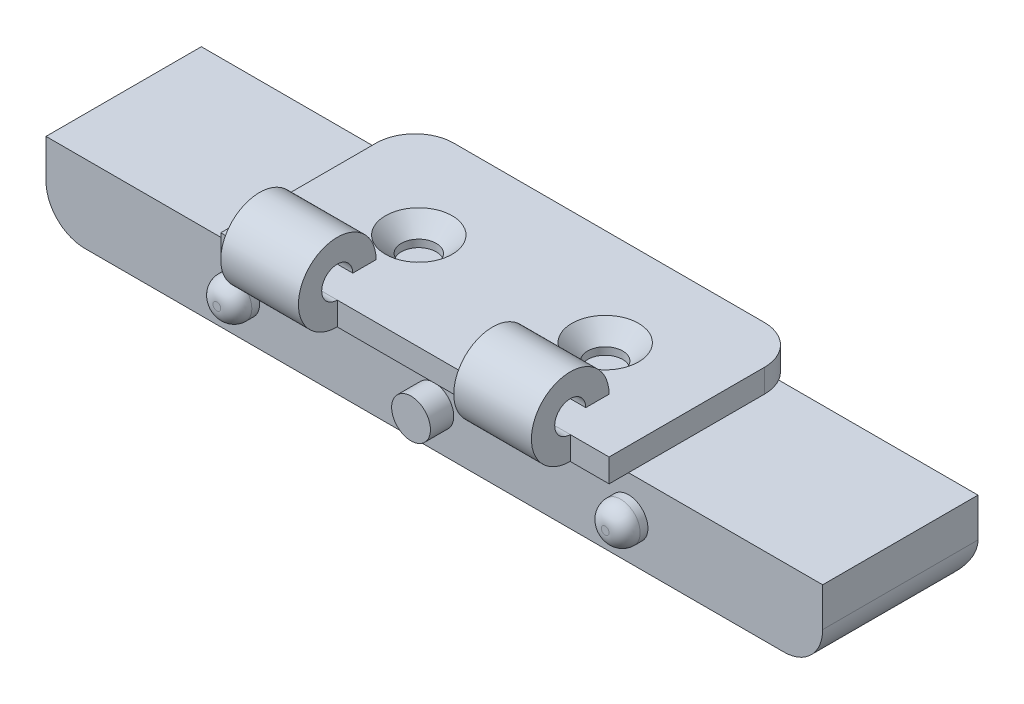
ISO-10303-21;
HEADER;
FILE_DESCRIPTION(('STEP AP214'),'2;1');
FILE_NAME('part.step','',(''),(''),'','','');
FILE_SCHEMA(('AUTOMOTIVE_DESIGN { 1 0 10303 214 1 1 1 1 }'));
ENDSEC;
DATA;
#1=APPLICATION_CONTEXT('core data for automotive mechanical design processes');
#2=APPLICATION_PROTOCOL_DEFINITION('international standard','automotive_design',2000,#1);
#3=PRODUCT_CONTEXT('',#1,'mechanical');
#4=PRODUCT('Part','Part','',(#3));
#5=PRODUCT_RELATED_PRODUCT_CATEGORY('part','',(#4));
#6=PRODUCT_DEFINITION_FORMATION('','',#4);
#7=PRODUCT_DEFINITION_CONTEXT('part definition',#1,'design');
#8=PRODUCT_DEFINITION('design','',#6,#7);
#9=PRODUCT_DEFINITION_SHAPE('','',#8);
#10=(LENGTH_UNIT() NAMED_UNIT(*) SI_UNIT(.MILLI.,.METRE.));
#11=(NAMED_UNIT(*) PLANE_ANGLE_UNIT() SI_UNIT($,.RADIAN.));
#12=(NAMED_UNIT(*) SI_UNIT($,.STERADIAN.) SOLID_ANGLE_UNIT());
#13=UNCERTAINTY_MEASURE_WITH_UNIT(LENGTH_MEASURE(1.E-05),#10,'distance_accuracy_value','');
#14=(GEOMETRIC_REPRESENTATION_CONTEXT(3) GLOBAL_UNCERTAINTY_ASSIGNED_CONTEXT((#13)) GLOBAL_UNIT_ASSIGNED_CONTEXT((#10,
#11,#12)) REPRESENTATION_CONTEXT('',''));
#15=CARTESIAN_POINT('',(0.,0.,0.));
#16=DIRECTION('',(0.,0.,1.));
#17=DIRECTION('',(1.,0.,0.));
#18=AXIS2_PLACEMENT_3D('',#15,#16,#17);
#19=CARTESIAN_POINT('',(-20.,-3.,-7.5));
#20=DIRECTION('',(0.,-1.,0.));
#21=DIRECTION('',(0.,0.,-1.));
#22=AXIS2_PLACEMENT_3D('',#19,#20,#21);
#23=PLANE('',#22);
#24=DIRECTION('',(1.,0.,0.));
#25=VECTOR('',#24,1.);
#26=CARTESIAN_POINT('',(-50.,-3.,10.));
#27=LINE('',#26,#25);
#28=CARTESIAN_POINT('',(-25.,-3.,10.));
#29=VERTEX_POINT('',#28);
#30=CARTESIAN_POINT('',(25.,-3.,10.));
#31=VERTEX_POINT('',#30);
#32=EDGE_CURVE('E228',#29,#31,#27,.T.);
#33=ORIENTED_EDGE('',*,*,#32,.T.);
#34=DIRECTION('',(0.,0.,-1.));
#35=VECTOR('',#34,1.);
#36=CARTESIAN_POINT('',(25.,-3.,12.5));
#37=LINE('',#36,#35);
#38=CARTESIAN_POINT('',(25.,-3.,12.5));
#39=VERTEX_POINT('',#38);
#40=EDGE_CURVE('E330',#39,#31,#37,.T.);
#41=ORIENTED_EDGE('',*,*,#40,.F.);
#42=DIRECTION('',(1.,0.,0.));
#43=VECTOR('',#42,1.);
#44=CARTESIAN_POINT('',(-25.,-3.,12.5));
#45=LINE('',#44,#43);
#46=CARTESIAN_POINT('',(20.,-3.,12.5));
#47=VERTEX_POINT('',#46);
#48=EDGE_CURVE('E325',#47,#39,#45,.T.);
#49=ORIENTED_EDGE('',*,*,#48,.F.);
#50=DIRECTION('',(1.,0.,0.));
#51=VECTOR('',#50,1.);
#52=CARTESIAN_POINT('',(20.,-3.,12.5));
#53=LINE('',#52,#51);
#54=CARTESIAN_POINT('',(10.,-3.,12.5));
#55=VERTEX_POINT('',#54);
#56=EDGE_CURVE('E289',#47,#55,#53,.F.);
#57=ORIENTED_EDGE('',*,*,#56,.T.);
#58=CARTESIAN_POINT('',(-10.,-3.,12.5));
#59=VERTEX_POINT('',#58);
#60=EDGE_CURVE('E331',#59,#55,#45,.T.);
#61=ORIENTED_EDGE('',*,*,#60,.F.);
#62=DIRECTION('',(1.,0.,0.));
#63=VECTOR('',#62,1.);
#64=CARTESIAN_POINT('',(-10.,-3.,12.5));
#65=LINE('',#64,#63);
#66=CARTESIAN_POINT('',(-20.,-3.,12.5));
#67=VERTEX_POINT('',#66);
#68=EDGE_CURVE('E258',#59,#67,#65,.F.);
#69=ORIENTED_EDGE('',*,*,#68,.T.);
#70=CARTESIAN_POINT('',(-25.,-3.,12.5));
#71=VERTEX_POINT('',#70);
#72=EDGE_CURVE('E327',#71,#67,#45,.T.);
#73=ORIENTED_EDGE('',*,*,#72,.F.);
#74=DIRECTION('',(0.,0.,1.));
#75=VECTOR('',#74,1.);
#76=CARTESIAN_POINT('',(-25.,-3.,12.5));
#77=LINE('',#76,#75);
#78=EDGE_CURVE('E326',#29,#71,#77,.T.);
#79=ORIENTED_EDGE('',*,*,#78,.F.);
#80=EDGE_LOOP('',(#33,#41,#49,#57,#61,#69,#73,#79));
#81=FACE_BOUND('',#80,.T.);
#82=ADVANCED_FACE('F39',(#81),#23,.T.);
#83=CARTESIAN_POINT('',(-20.,0.,-7.5));
#84=DIRECTION('',(0.,-1.,0.));
#85=DIRECTION('',(0.,0.,-1.));
#86=AXIS2_PLACEMENT_3D('',#83,#84,#85);
#87=PLANE('',#86);
#88=CARTESIAN_POINT('',(-12.,0.,0.));
#89=DIRECTION('',(0.,1.,0.));
#90=DIRECTION('',(0.,0.,1.));
#91=AXIS2_PLACEMENT_3D('',#88,#89,#90);
#92=CIRCLE('',#91,4.3);
#93=CARTESIAN_POINT('',(-12.,0.,4.3));
#94=VERTEX_POINT('',#93);
#95=EDGE_CURVE('E239',#94,#94,#92,.T.);
#96=ORIENTED_EDGE('',*,*,#95,.F.);
#97=EDGE_LOOP('',(#96));
#98=FACE_BOUND('',#97,.T.);
#99=DIRECTION('',(0.,0.,1.));
#100=VECTOR('',#99,1.);
#101=CARTESIAN_POINT('',(-25.,0.,12.5));
#102=LINE('',#101,#100);
#103=CARTESIAN_POINT('',(-25.,0.,-7.49999999999997));
#104=VERTEX_POINT('',#103);
#105=CARTESIAN_POINT('',(-25.,0.,12.5));
#106=VERTEX_POINT('',#105);
#107=EDGE_CURVE('E319',#104,#106,#102,.T.);
#108=ORIENTED_EDGE('',*,*,#107,.T.);
#109=DIRECTION('',(1.,0.,0.));
#110=VECTOR('',#109,1.);
#111=CARTESIAN_POINT('',(-25.,0.,12.5));
#112=LINE('',#111,#110);
#113=CARTESIAN_POINT('',(-20.,0.,12.5));
#114=VERTEX_POINT('',#113);
#115=EDGE_CURVE('E347',#106,#114,#112,.T.);
#116=ORIENTED_EDGE('',*,*,#115,.T.);
#117=DIRECTION('',(1.,0.,0.));
#118=VECTOR('',#117,1.);
#119=CARTESIAN_POINT('',(-10.,0.,12.5));
#120=LINE('',#119,#118);
#121=CARTESIAN_POINT('',(-10.,0.,12.5));
#122=VERTEX_POINT('',#121);
#123=EDGE_CURVE('E273',#122,#114,#120,.F.);
#124=ORIENTED_EDGE('',*,*,#123,.F.);
#125=CARTESIAN_POINT('',(10.,0.,12.5));
#126=VERTEX_POINT('',#125);
#127=EDGE_CURVE('E351',#122,#126,#112,.T.);
#128=ORIENTED_EDGE('',*,*,#127,.T.);
#129=DIRECTION('',(1.,0.,0.));
#130=VECTOR('',#129,1.);
#131=CARTESIAN_POINT('',(20.,0.,12.5));
#132=LINE('',#131,#130);
#133=CARTESIAN_POINT('',(20.,0.,12.5));
#134=VERTEX_POINT('',#133);
#135=EDGE_CURVE('E304',#134,#126,#132,.F.);
#136=ORIENTED_EDGE('',*,*,#135,.F.);
#137=CARTESIAN_POINT('',(25.,0.,12.5));
#138=VERTEX_POINT('',#137);
#139=EDGE_CURVE('E346',#134,#138,#112,.T.);
#140=ORIENTED_EDGE('',*,*,#139,.T.);
#141=DIRECTION('',(0.,0.,-1.));
#142=VECTOR('',#141,1.);
#143=CARTESIAN_POINT('',(25.,0.,12.5));
#144=LINE('',#143,#142);
#145=CARTESIAN_POINT('',(25.,0.,-7.49999999999997));
#146=VERTEX_POINT('',#145);
#147=EDGE_CURVE('E350',#138,#146,#144,.T.);
#148=ORIENTED_EDGE('',*,*,#147,.T.);
#149=CARTESIAN_POINT('',(20.,0.,-7.5));
#150=DIRECTION('',(0.,1.,0.));
#151=DIRECTION('',(0.,0.,-1.));
#152=AXIS2_PLACEMENT_3D('',#149,#150,#151);
#153=CIRCLE('',#152,5.);
#154=CARTESIAN_POINT('',(20.,0.,-12.5));
#155=VERTEX_POINT('',#154);
#156=EDGE_CURVE('E354',#146,#155,#153,.T.);
#157=ORIENTED_EDGE('',*,*,#156,.T.);
#158=DIRECTION('',(-1.,0.,0.));
#159=VECTOR('',#158,1.);
#160=CARTESIAN_POINT('',(-20.,0.,-12.5));
#161=LINE('',#160,#159);
#162=CARTESIAN_POINT('',(-20.,0.,-12.5));
#163=VERTEX_POINT('',#162);
#164=EDGE_CURVE('E357',#155,#163,#161,.T.);
#165=ORIENTED_EDGE('',*,*,#164,.T.);
#166=CARTESIAN_POINT('',(-20.,0.,-7.5));
#167=DIRECTION('',(0.,1.,0.));
#168=DIRECTION('',(0.,0.,-1.));
#169=AXIS2_PLACEMENT_3D('',#166,#167,#168);
#170=CIRCLE('',#169,5.);
#171=EDGE_CURVE('E360',#163,#104,#170,.T.);
#172=ORIENTED_EDGE('',*,*,#171,.T.);
#173=EDGE_LOOP('',(#108,#116,#124,#128,#136,#140,#148,#157,#165,#172));
#174=FACE_BOUND('',#173,.T.);
#175=CARTESIAN_POINT('',(12.,0.,0.));
#176=DIRECTION('',(0.,1.,0.));
#177=DIRECTION('',(0.,0.,1.));
#178=AXIS2_PLACEMENT_3D('',#175,#176,#177);
#179=CIRCLE('',#178,4.3);
#180=CARTESIAN_POINT('',(12.,0.,4.3));
#181=VERTEX_POINT('',#180);
#182=EDGE_CURVE('E248',#181,#181,#179,.T.);
#183=ORIENTED_EDGE('',*,*,#182,.F.);
#184=EDGE_LOOP('',(#183));
#185=FACE_BOUND('',#184,.T.);
#186=ADVANCED_FACE('F413',(#98,#174,#185),#87,.F.);
#187=CARTESIAN_POINT('',(-25.,-3.,12.5));
#188=DIRECTION('',(0.,0.,1.));
#189=DIRECTION('',(1.,0.,0.));
#190=AXIS2_PLACEMENT_3D('',#187,#188,#189);
#191=PLANE('',#190);
#192=ORIENTED_EDGE('',*,*,#127,.F.);
#193=DIRECTION('',(0.,-1.,0.));
#194=VECTOR('',#193,1.);
#195=CARTESIAN_POINT('',(-10.,0.,12.5));
#196=LINE('',#195,#194);
#197=EDGE_CURVE('E265',#122,#59,#196,.T.);
#198=ORIENTED_EDGE('',*,*,#197,.T.);
#199=ORIENTED_EDGE('',*,*,#60,.T.);
#200=DIRECTION('',(0.,-1.,0.));
#201=VECTOR('',#200,1.);
#202=CARTESIAN_POINT('',(10.,0.,12.5));
#203=LINE('',#202,#201);
#204=EDGE_CURVE('E312',#126,#55,#203,.T.);
#205=ORIENTED_EDGE('',*,*,#204,.F.);
#206=EDGE_LOOP('',(#192,#198,#199,#205));
#207=FACE_BOUND('',#206,.T.);
#208=ADVANCED_FACE('F422',(#207),#191,.T.);
#209=ORIENTED_EDGE('',*,*,#139,.F.);
#210=DIRECTION('',(0.,-1.,0.));
#211=VECTOR('',#210,1.);
#212=CARTESIAN_POINT('',(20.,0.,12.5));
#213=LINE('',#212,#211);
#214=EDGE_CURVE('E296',#134,#47,#213,.T.);
#215=ORIENTED_EDGE('',*,*,#214,.T.);
#216=ORIENTED_EDGE('',*,*,#48,.T.);
#217=DIRECTION('',(0.,1.,0.));
#218=VECTOR('',#217,1.);
#219=CARTESIAN_POINT('',(25.,-3.,12.5));
#220=LINE('',#219,#218);
#221=EDGE_CURVE('E372',#39,#138,#220,.T.);
#222=ORIENTED_EDGE('',*,*,#221,.T.);
#223=EDGE_LOOP('',(#209,#215,#216,#222));
#224=FACE_BOUND('',#223,.T.);
#225=ADVANCED_FACE('F442',(#224),#191,.T.);
#226=CARTESIAN_POINT('',(-25.,-3.,12.5));
#227=DIRECTION('',(-1.,0.,0.));
#228=DIRECTION('',(0.,0.,1.));
#229=AXIS2_PLACEMENT_3D('',#226,#227,#228);
#230=PLANE('',#229);
#231=ORIENTED_EDGE('',*,*,#107,.F.);
#232=DIRECTION('',(0.,1.,0.));
#233=VECTOR('',#232,1.);
#234=CARTESIAN_POINT('',(-25.,-3.,-7.49999999999997));
#235=LINE('',#234,#233);
#236=CARTESIAN_POINT('',(-25.,-3.,-7.49999999999997));
#237=VERTEX_POINT('',#236);
#238=EDGE_CURVE('E363',#237,#104,#235,.T.);
#239=ORIENTED_EDGE('',*,*,#238,.F.);
#240=EDGE_CURVE('E322',#237,#29,#77,.T.);
#241=ORIENTED_EDGE('',*,*,#240,.T.);
#242=ORIENTED_EDGE('',*,*,#78,.T.);
#243=DIRECTION('',(0.,1.,0.));
#244=VECTOR('',#243,1.);
#245=CARTESIAN_POINT('',(-25.,-3.,12.5));
#246=LINE('',#245,#244);
#247=EDGE_CURVE('E343',#71,#106,#246,.T.);
#248=ORIENTED_EDGE('',*,*,#247,.T.);
#249=EDGE_LOOP('',(#231,#239,#241,#242,#248));
#250=FACE_BOUND('',#249,.T.);
#251=ADVANCED_FACE('F834',(#250),#230,.T.);
#252=CARTESIAN_POINT('',(-20.,-3.,-7.5));
#253=DIRECTION('',(0.,1.,0.));
#254=DIRECTION('',(0.,0.,1.));
#255=AXIS2_PLACEMENT_3D('',#252,#253,#254);
#256=CYLINDRICAL_SURFACE('',#255,5.);
#257=ORIENTED_EDGE('',*,*,#171,.F.);
#258=DIRECTION('',(0.,1.,0.));
#259=VECTOR('',#258,1.);
#260=CARTESIAN_POINT('',(-20.,-3.,-12.5));
#261=LINE('',#260,#259);
#262=CARTESIAN_POINT('',(-20.,-3.,-12.5));
#263=VERTEX_POINT('',#262);
#264=EDGE_CURVE('E366',#263,#163,#261,.T.);
#265=ORIENTED_EDGE('',*,*,#264,.F.);
#266=CARTESIAN_POINT('',(-20.,-3.,-7.5));
#267=DIRECTION('',(0.,1.,0.));
#268=DIRECTION('',(0.,0.,-1.));
#269=AXIS2_PLACEMENT_3D('',#266,#267,#268);
#270=CIRCLE('',#269,5.);
#271=CARTESIAN_POINT('',(-24.3301270189222,-3.,-10.));
#272=VERTEX_POINT('',#271);
#273=EDGE_CURVE('E340',#263,#272,#270,.T.);
#274=ORIENTED_EDGE('',*,*,#273,.T.);
#275=CARTESIAN_POINT('',(-20.,-3.,-7.5));
#276=DIRECTION('',(0.,1.,0.));
#277=DIRECTION('',(0.,0.,1.));
#278=AXIS2_PLACEMENT_3D('',#275,#276,#277);
#279=CIRCLE('',#278,5.);
#280=EDGE_CURVE('E236',#237,#272,#279,.F.);
#281=ORIENTED_EDGE('',*,*,#280,.F.);
#282=ORIENTED_EDGE('',*,*,#238,.T.);
#283=EDGE_LOOP('',(#257,#265,#274,#281,#282));
#284=FACE_BOUND('',#283,.T.);
#285=ADVANCED_FACE('F448',(#284),#256,.T.);
#286=CARTESIAN_POINT('',(-20.,-3.,-12.5));
#287=DIRECTION('',(0.,0.,-1.));
#288=DIRECTION('',(-1.,0.,0.));
#289=AXIS2_PLACEMENT_3D('',#286,#287,#288);
#290=PLANE('',#289);
#291=ORIENTED_EDGE('',*,*,#164,.F.);
#292=DIRECTION('',(0.,1.,0.));
#293=VECTOR('',#292,1.);
#294=CARTESIAN_POINT('',(20.,-3.,-12.5));
#295=LINE('',#294,#293);
#296=CARTESIAN_POINT('',(20.,-3.,-12.5));
#297=VERTEX_POINT('',#296);
#298=EDGE_CURVE('E368',#297,#155,#295,.T.);
#299=ORIENTED_EDGE('',*,*,#298,.F.);
#300=DIRECTION('',(-1.,0.,0.));
#301=VECTOR('',#300,1.);
#302=CARTESIAN_POINT('',(-20.,-3.,-12.5));
#303=LINE('',#302,#301);
#304=EDGE_CURVE('E337',#297,#263,#303,.T.);
#305=ORIENTED_EDGE('',*,*,#304,.T.);
#306=ORIENTED_EDGE('',*,*,#264,.T.);
#307=EDGE_LOOP('',(#291,#299,#305,#306));
#308=FACE_BOUND('',#307,.T.);
#309=ADVANCED_FACE('F840',(#308),#290,.T.);
#310=CARTESIAN_POINT('',(20.,-3.,-7.5));
#311=DIRECTION('',(0.,1.,0.));
#312=DIRECTION('',(0.,0.,1.));
#313=AXIS2_PLACEMENT_3D('',#310,#311,#312);
#314=CYLINDRICAL_SURFACE('',#313,5.);
#315=ORIENTED_EDGE('',*,*,#156,.F.);
#316=DIRECTION('',(0.,1.,0.));
#317=VECTOR('',#316,1.);
#318=CARTESIAN_POINT('',(25.,-3.,-7.49999999999997));
#319=LINE('',#318,#317);
#320=CARTESIAN_POINT('',(25.,-3.,-7.49999999999997));
#321=VERTEX_POINT('',#320);
#322=EDGE_CURVE('E370',#321,#146,#319,.T.);
#323=ORIENTED_EDGE('',*,*,#322,.F.);
#324=CARTESIAN_POINT('',(20.,-3.,-7.5));
#325=DIRECTION('',(0.,1.,0.));
#326=DIRECTION('',(0.,0.,-1.));
#327=AXIS2_PLACEMENT_3D('',#324,#325,#326);
#328=CIRCLE('',#327,5.);
#329=CARTESIAN_POINT('',(24.3301270189222,-3.,-10.));
#330=VERTEX_POINT('',#329);
#331=EDGE_CURVE('E335',#321,#330,#328,.T.);
#332=ORIENTED_EDGE('',*,*,#331,.T.);
#333=EDGE_CURVE('E334',#330,#297,#328,.T.);
#334=ORIENTED_EDGE('',*,*,#333,.T.);
#335=ORIENTED_EDGE('',*,*,#298,.T.);
#336=EDGE_LOOP('',(#315,#323,#332,#334,#335));
#337=FACE_BOUND('',#336,.T.);
#338=ADVANCED_FACE('F484',(#337),#314,.T.);
#339=CARTESIAN_POINT('',(25.,-3.,12.5));
#340=DIRECTION('',(1.,0.,0.));
#341=DIRECTION('',(0.,0.,-1.));
#342=AXIS2_PLACEMENT_3D('',#339,#340,#341);
#343=PLANE('',#342);
#344=ORIENTED_EDGE('',*,*,#147,.F.);
#345=ORIENTED_EDGE('',*,*,#221,.F.);
#346=ORIENTED_EDGE('',*,*,#40,.T.);
#347=DIRECTION('',(0.,0.,1.));
#348=VECTOR('',#347,1.);
#349=CARTESIAN_POINT('',(25.,-3.,12.5));
#350=LINE('',#349,#348);
#351=EDGE_CURVE('E231',#321,#31,#350,.T.);
#352=ORIENTED_EDGE('',*,*,#351,.F.);
#353=ORIENTED_EDGE('',*,*,#322,.T.);
#354=EDGE_LOOP('',(#344,#345,#346,#352,#353));
#355=FACE_BOUND('',#354,.T.);
#356=ADVANCED_FACE('F439',(#355),#343,.T.);
#357=DIRECTION('',(0.,-1.,0.));
#358=VECTOR('',#357,1.);
#359=CARTESIAN_POINT('',(-20.,0.,12.5));
#360=LINE('',#359,#358);
#361=EDGE_CURVE('E280',#114,#67,#360,.T.);
#362=ORIENTED_EDGE('',*,*,#361,.F.);
#363=ORIENTED_EDGE('',*,*,#115,.F.);
#364=ORIENTED_EDGE('',*,*,#247,.F.);
#365=ORIENTED_EDGE('',*,*,#72,.T.);
#366=EDGE_LOOP('',(#362,#363,#364,#365));
#367=FACE_BOUND('',#366,.T.);
#368=ADVANCED_FACE('F428',(#367),#191,.T.);
#369=DIRECTION('',(-1.,0.,0.));
#370=VECTOR('',#369,1.);
#371=CARTESIAN_POINT('',(-50.,-3.,-10.));
#372=LINE('',#371,#370);
#373=EDGE_CURVE('E203',#330,#272,#372,.T.);
#374=ORIENTED_EDGE('',*,*,#373,.T.);
#375=ORIENTED_EDGE('',*,*,#273,.F.);
#376=ORIENTED_EDGE('',*,*,#304,.F.);
#377=ORIENTED_EDGE('',*,*,#333,.F.);
#378=EDGE_LOOP('',(#374,#375,#376,#377));
#379=FACE_BOUND('',#378,.T.);
#380=ADVANCED_FACE('F416',(#379),#23,.T.);
#381=CARTESIAN_POINT('',(15.,1.99999999999998,10.5));
#382=DIRECTION('',(0.,1.,0.));
#383=DIRECTION('',(1.,0.,0.));
#384=AXIS2_PLACEMENT_3D('',#381,#382,#383);
#385=PLANE('',#384);
#386=DIRECTION('',(0.,0.,-1.));
#387=VECTOR('',#386,1.);
#388=CARTESIAN_POINT('',(20.,1.99999999999998,10.5));
#389=LINE('',#388,#387);
#390=CARTESIAN_POINT('',(20.,1.99999999999998,10.5));
#391=VERTEX_POINT('',#390);
#392=CARTESIAN_POINT('',(20.,1.99999999999995,7.5));
#393=VERTEX_POINT('',#392);
#394=EDGE_CURVE('E317',#391,#393,#389,.T.);
#395=ORIENTED_EDGE('',*,*,#394,.F.);
#396=DIRECTION('',(1.,0.,0.));
#397=VECTOR('',#396,1.);
#398=CARTESIAN_POINT('',(20.,1.99999999999998,10.5));
#399=LINE('',#398,#397);
#400=CARTESIAN_POINT('',(10.,1.99999999999998,10.5));
#401=VERTEX_POINT('',#400);
#402=EDGE_CURVE('E286',#401,#391,#399,.T.);
#403=ORIENTED_EDGE('',*,*,#402,.F.);
#404=DIRECTION('',(0.,0.,-1.));
#405=VECTOR('',#404,1.);
#406=CARTESIAN_POINT('',(10.,1.99999999999998,10.5));
#407=LINE('',#406,#405);
#408=CARTESIAN_POINT('',(10.,1.99999999999995,7.5));
#409=VERTEX_POINT('',#408);
#410=EDGE_CURVE('E315',#401,#409,#407,.T.);
#411=ORIENTED_EDGE('',*,*,#410,.T.);
#412=DIRECTION('',(1.,0.,0.));
#413=VECTOR('',#412,1.);
#414=CARTESIAN_POINT('',(20.,1.99999999999995,7.5));
#415=LINE('',#414,#413);
#416=EDGE_CURVE('E297',#409,#393,#415,.T.);
#417=ORIENTED_EDGE('',*,*,#416,.T.);
#418=EDGE_LOOP('',(#395,#403,#411,#417));
#419=FACE_BOUND('',#418,.T.);
#420=ADVANCED_FACE('F427',(#419),#385,.F.);
#421=CARTESIAN_POINT('',(10.,2.,12.5));
#422=DIRECTION('',(-1.,0.,0.));
#423=DIRECTION('',(0.,0.,1.));
#424=AXIS2_PLACEMENT_3D('',#421,#422,#423);
#425=PLANE('',#424);
#426=ORIENTED_EDGE('',*,*,#410,.F.);
#427=CARTESIAN_POINT('',(10.,2.,12.5));
#428=DIRECTION('',(1.,0.,0.));
#429=DIRECTION('',(0.,0.,-1.));
#430=AXIS2_PLACEMENT_3D('',#427,#428,#429);
#431=CIRCLE('',#430,2.);
#432=EDGE_CURVE('E300',#126,#401,#431,.F.);
#433=ORIENTED_EDGE('',*,*,#432,.F.);
#434=ORIENTED_EDGE('',*,*,#204,.T.);
#435=CARTESIAN_POINT('',(10.,2.,12.5));
#436=DIRECTION('',(1.,0.,0.));
#437=DIRECTION('',(0.,0.,-1.));
#438=AXIS2_PLACEMENT_3D('',#435,#436,#437);
#439=CIRCLE('',#438,5.);
#440=EDGE_CURVE('E292',#55,#409,#439,.F.);
#441=ORIENTED_EDGE('',*,*,#440,.T.);
#442=EDGE_LOOP('',(#426,#433,#434,#441));
#443=FACE_BOUND('',#442,.T.);
#444=ADVANCED_FACE('F435',(#443),#425,.T.);
#445=CARTESIAN_POINT('',(20.,2.,12.5));
#446=DIRECTION('',(-1.,0.,0.));
#447=DIRECTION('',(0.,0.,1.));
#448=AXIS2_PLACEMENT_3D('',#445,#446,#447);
#449=PLANE('',#448);
#450=CARTESIAN_POINT('',(20.,2.,12.5));
#451=DIRECTION('',(1.,0.,0.));
#452=DIRECTION('',(0.,0.,-1.));
#453=AXIS2_PLACEMENT_3D('',#450,#451,#452);
#454=CIRCLE('',#453,2.);
#455=EDGE_CURVE('E307',#391,#134,#454,.T.);
#456=ORIENTED_EDGE('',*,*,#455,.F.);
#457=ORIENTED_EDGE('',*,*,#394,.T.);
#458=CARTESIAN_POINT('',(20.,2.,12.5));
#459=DIRECTION('',(1.,0.,0.));
#460=DIRECTION('',(0.,0.,-1.));
#461=AXIS2_PLACEMENT_3D('',#458,#459,#460);
#462=CIRCLE('',#461,5.);
#463=EDGE_CURVE('E293',#393,#47,#462,.T.);
#464=ORIENTED_EDGE('',*,*,#463,.T.);
#465=ORIENTED_EDGE('',*,*,#214,.F.);
#466=EDGE_LOOP('',(#456,#457,#464,#465));
#467=FACE_BOUND('',#466,.T.);
#468=ADVANCED_FACE('F508',(#467),#449,.F.);
#469=CARTESIAN_POINT('',(20.,2.,12.5));
#470=DIRECTION('',(1.,0.,0.));
#471=DIRECTION('',(0.,0.,-1.));
#472=AXIS2_PLACEMENT_3D('',#469,#470,#471);
#473=CYLINDRICAL_SURFACE('',#472,5.);
#474=ORIENTED_EDGE('',*,*,#56,.F.);
#475=ORIENTED_EDGE('',*,*,#463,.F.);
#476=ORIENTED_EDGE('',*,*,#416,.F.);
#477=ORIENTED_EDGE('',*,*,#440,.F.);
#478=EDGE_LOOP('',(#474,#475,#476,#477));
#479=FACE_BOUND('',#478,.T.);
#480=ADVANCED_FACE('F501',(#479),#473,.T.);
#481=CARTESIAN_POINT('',(20.,2.,12.5));
#482=DIRECTION('',(1.,0.,0.));
#483=DIRECTION('',(0.,0.,-1.));
#484=AXIS2_PLACEMENT_3D('',#481,#482,#483);
#485=CYLINDRICAL_SURFACE('',#484,2.);
#486=ORIENTED_EDGE('',*,*,#135,.T.);
#487=ORIENTED_EDGE('',*,*,#432,.T.);
#488=ORIENTED_EDGE('',*,*,#402,.T.);
#489=ORIENTED_EDGE('',*,*,#455,.T.);
#490=EDGE_LOOP('',(#486,#487,#488,#489));
#491=FACE_BOUND('',#490,.T.);
#492=ADVANCED_FACE('F506',(#491),#485,.F.);
#493=CARTESIAN_POINT('',(-15.,1.99999999999998,10.5));
#494=DIRECTION('',(0.,1.,0.));
#495=DIRECTION('',(1.,0.,0.));
#496=AXIS2_PLACEMENT_3D('',#493,#494,#495);
#497=PLANE('',#496);
#498=DIRECTION('',(0.,0.,-1.));
#499=VECTOR('',#498,1.);
#500=CARTESIAN_POINT('',(-10.,1.99999999999998,10.5));
#501=LINE('',#500,#499);
#502=CARTESIAN_POINT('',(-10.,1.99999999999998,10.5));
#503=VERTEX_POINT('',#502);
#504=CARTESIAN_POINT('',(-10.,1.99999999999995,7.5));
#505=VERTEX_POINT('',#504);
#506=EDGE_CURVE('E284',#503,#505,#501,.T.);
#507=ORIENTED_EDGE('',*,*,#506,.F.);
#508=DIRECTION('',(1.,0.,0.));
#509=VECTOR('',#508,1.);
#510=CARTESIAN_POINT('',(-10.,1.99999999999998,10.5));
#511=LINE('',#510,#509);
#512=CARTESIAN_POINT('',(-20.,1.99999999999998,10.5));
#513=VERTEX_POINT('',#512);
#514=EDGE_CURVE('E257',#513,#503,#511,.T.);
#515=ORIENTED_EDGE('',*,*,#514,.F.);
#516=DIRECTION('',(0.,0.,-1.));
#517=VECTOR('',#516,1.);
#518=CARTESIAN_POINT('',(-20.,1.99999999999998,10.5));
#519=LINE('',#518,#517);
#520=CARTESIAN_POINT('',(-20.,1.99999999999995,7.5));
#521=VERTEX_POINT('',#520);
#522=EDGE_CURVE('E282',#513,#521,#519,.T.);
#523=ORIENTED_EDGE('',*,*,#522,.T.);
#524=DIRECTION('',(1.,0.,0.));
#525=VECTOR('',#524,1.);
#526=CARTESIAN_POINT('',(-10.,1.99999999999995,7.5));
#527=LINE('',#526,#525);
#528=EDGE_CURVE('E266',#521,#505,#527,.T.);
#529=ORIENTED_EDGE('',*,*,#528,.T.);
#530=EDGE_LOOP('',(#507,#515,#523,#529));
#531=FACE_BOUND('',#530,.T.);
#532=ADVANCED_FACE('F518',(#531),#497,.F.);
#533=CARTESIAN_POINT('',(-20.,2.,12.5));
#534=DIRECTION('',(-1.,0.,0.));
#535=DIRECTION('',(0.,0.,1.));
#536=AXIS2_PLACEMENT_3D('',#533,#534,#535);
#537=PLANE('',#536);
#538=ORIENTED_EDGE('',*,*,#522,.F.);
#539=CARTESIAN_POINT('',(-20.,2.,12.5));
#540=DIRECTION('',(1.,0.,0.));
#541=DIRECTION('',(0.,0.,-1.));
#542=AXIS2_PLACEMENT_3D('',#539,#540,#541);
#543=CIRCLE('',#542,2.);
#544=EDGE_CURVE('E269',#114,#513,#543,.F.);
#545=ORIENTED_EDGE('',*,*,#544,.F.);
#546=ORIENTED_EDGE('',*,*,#361,.T.);
#547=CARTESIAN_POINT('',(-20.,2.,12.5));
#548=DIRECTION('',(1.,0.,0.));
#549=DIRECTION('',(0.,0.,-1.));
#550=AXIS2_PLACEMENT_3D('',#547,#548,#549);
#551=CIRCLE('',#550,5.);
#552=EDGE_CURVE('E261',#67,#521,#551,.F.);
#553=ORIENTED_EDGE('',*,*,#552,.T.);
#554=EDGE_LOOP('',(#538,#545,#546,#553));
#555=FACE_BOUND('',#554,.T.);
#556=ADVANCED_FACE('F524',(#555),#537,.T.);
#557=CARTESIAN_POINT('',(-10.,2.,12.5));
#558=DIRECTION('',(-1.,0.,0.));
#559=DIRECTION('',(0.,0.,1.));
#560=AXIS2_PLACEMENT_3D('',#557,#558,#559);
#561=PLANE('',#560);
#562=CARTESIAN_POINT('',(-10.,2.,12.5));
#563=DIRECTION('',(1.,0.,0.));
#564=DIRECTION('',(0.,0.,-1.));
#565=AXIS2_PLACEMENT_3D('',#562,#563,#564);
#566=CIRCLE('',#565,2.);
#567=EDGE_CURVE('E275',#503,#122,#566,.T.);
#568=ORIENTED_EDGE('',*,*,#567,.F.);
#569=ORIENTED_EDGE('',*,*,#506,.T.);
#570=CARTESIAN_POINT('',(-10.,2.,12.5));
#571=DIRECTION('',(1.,0.,0.));
#572=DIRECTION('',(0.,0.,-1.));
#573=AXIS2_PLACEMENT_3D('',#570,#571,#572);
#574=CIRCLE('',#573,5.);
#575=EDGE_CURVE('E262',#505,#59,#574,.T.);
#576=ORIENTED_EDGE('',*,*,#575,.T.);
#577=ORIENTED_EDGE('',*,*,#197,.F.);
#578=EDGE_LOOP('',(#568,#569,#576,#577));
#579=FACE_BOUND('',#578,.T.);
#580=ADVANCED_FACE('F520',(#579),#561,.F.);
#581=CARTESIAN_POINT('',(-10.,2.,12.5));
#582=DIRECTION('',(1.,0.,0.));
#583=DIRECTION('',(0.,0.,-1.));
#584=AXIS2_PLACEMENT_3D('',#581,#582,#583);
#585=CYLINDRICAL_SURFACE('',#584,5.);
#586=ORIENTED_EDGE('',*,*,#68,.F.);
#587=ORIENTED_EDGE('',*,*,#575,.F.);
#588=ORIENTED_EDGE('',*,*,#528,.F.);
#589=ORIENTED_EDGE('',*,*,#552,.F.);
#590=EDGE_LOOP('',(#586,#587,#588,#589));
#591=FACE_BOUND('',#590,.T.);
#592=ADVANCED_FACE('F523',(#591),#585,.T.);
#593=CARTESIAN_POINT('',(-10.,2.,12.5));
#594=DIRECTION('',(1.,0.,0.));
#595=DIRECTION('',(0.,0.,-1.));
#596=AXIS2_PLACEMENT_3D('',#593,#594,#595);
#597=CYLINDRICAL_SURFACE('',#596,2.);
#598=ORIENTED_EDGE('',*,*,#123,.T.);
#599=ORIENTED_EDGE('',*,*,#544,.T.);
#600=ORIENTED_EDGE('',*,*,#514,.T.);
#601=ORIENTED_EDGE('',*,*,#567,.T.);
#602=EDGE_LOOP('',(#598,#599,#600,#601));
#603=FACE_BOUND('',#602,.T.);
#604=ADVANCED_FACE('F532',(#603),#597,.F.);
#605=CARTESIAN_POINT('',(12.,0.,0.));
#606=DIRECTION('',(0.,1.,0.));
#607=DIRECTION('',(0.,0.,1.));
#608=AXIS2_PLACEMENT_3D('',#605,#606,#607);
#609=CYLINDRICAL_SURFACE('',#608,2.25);
#610=CARTESIAN_POINT('',(12.,-3.,0.));
#611=DIRECTION('',(0.,1.,0.));
#612=DIRECTION('',(0.,0.,1.));
#613=AXIS2_PLACEMENT_3D('',#610,#611,#612);
#614=CIRCLE('',#613,2.25);
#615=CARTESIAN_POINT('',(12.,-3.,2.25));
#616=VERTEX_POINT('',#615);
#617=EDGE_CURVE('E254',#616,#616,#614,.T.);
#618=ORIENTED_EDGE('',*,*,#617,.F.);
#619=EDGE_LOOP('',(#618));
#620=FACE_BOUND('',#619,.T.);
#621=CARTESIAN_POINT('',(12.,-2.05,0.));
#622=DIRECTION('',(0.,1.,0.));
#623=DIRECTION('',(0.,0.,1.));
#624=AXIS2_PLACEMENT_3D('',#621,#622,#623);
#625=CIRCLE('',#624,2.25);
#626=CARTESIAN_POINT('',(12.,-2.05,2.25));
#627=VERTEX_POINT('',#626);
#628=EDGE_CURVE('E251',#627,#627,#625,.T.);
#629=ORIENTED_EDGE('',*,*,#628,.T.);
#630=EDGE_LOOP('',(#629));
#631=FACE_BOUND('',#630,.T.);
#632=ADVANCED_FACE('F535',(#620,#631),#609,.F.);
#633=CARTESIAN_POINT('',(12.,0.,0.));
#634=DIRECTION('',(0.,1.,0.));
#635=DIRECTION('',(0.,0.,1.));
#636=AXIS2_PLACEMENT_3D('',#633,#634,#635);
#637=CONICAL_SURFACE('',#636,4.3,0.785398163397448);
#638=ORIENTED_EDGE('',*,*,#628,.F.);
#639=EDGE_LOOP('',(#638));
#640=FACE_BOUND('',#639,.T.);
#641=ORIENTED_EDGE('',*,*,#182,.T.);
#642=EDGE_LOOP('',(#641));
#643=FACE_BOUND('',#642,.T.);
#644=ADVANCED_FACE('F542',(#640,#643),#637,.F.);
#645=CARTESIAN_POINT('',(-12.,0.,0.));
#646=DIRECTION('',(0.,1.,0.));
#647=DIRECTION('',(0.,0.,1.));
#648=AXIS2_PLACEMENT_3D('',#645,#646,#647);
#649=CYLINDRICAL_SURFACE('',#648,2.25);
#650=CARTESIAN_POINT('',(-12.,-3.,0.));
#651=DIRECTION('',(0.,1.,0.));
#652=DIRECTION('',(0.,0.,1.));
#653=AXIS2_PLACEMENT_3D('',#650,#651,#652);
#654=CIRCLE('',#653,2.25);
#655=CARTESIAN_POINT('',(-12.,-3.,2.25));
#656=VERTEX_POINT('',#655);
#657=EDGE_CURVE('E245',#656,#656,#654,.T.);
#658=ORIENTED_EDGE('',*,*,#657,.F.);
#659=EDGE_LOOP('',(#658));
#660=FACE_BOUND('',#659,.T.);
#661=CARTESIAN_POINT('',(-12.,-2.05,0.));
#662=DIRECTION('',(0.,1.,0.));
#663=DIRECTION('',(0.,0.,1.));
#664=AXIS2_PLACEMENT_3D('',#661,#662,#663);
#665=CIRCLE('',#664,2.25);
#666=CARTESIAN_POINT('',(-12.,-2.05,2.25));
#667=VERTEX_POINT('',#666);
#668=EDGE_CURVE('E242',#667,#667,#665,.T.);
#669=ORIENTED_EDGE('',*,*,#668,.T.);
#670=EDGE_LOOP('',(#669));
#671=FACE_BOUND('',#670,.T.);
#672=ADVANCED_FACE('F546',(#660,#671),#649,.F.);
#673=CARTESIAN_POINT('',(-12.,0.,0.));
#674=DIRECTION('',(0.,1.,0.));
#675=DIRECTION('',(0.,0.,1.));
#676=AXIS2_PLACEMENT_3D('',#673,#674,#675);
#677=CONICAL_SURFACE('',#676,4.3,0.785398163397448);
#678=ORIENTED_EDGE('',*,*,#668,.F.);
#679=EDGE_LOOP('',(#678));
#680=FACE_BOUND('',#679,.T.);
#681=ORIENTED_EDGE('',*,*,#95,.T.);
#682=EDGE_LOOP('',(#681));
#683=FACE_BOUND('',#682,.T.);
#684=ADVANCED_FACE('F550',(#680,#683),#677,.F.);
#685=CARTESIAN_POINT('',(0.,-3.,0.));
#686=DIRECTION('',(0.,1.,0.));
#687=DIRECTION('',(0.,0.,1.));
#688=AXIS2_PLACEMENT_3D('',#685,#686,#687);
#689=PLANE('',#688);
#690=ORIENTED_EDGE('',*,*,#657,.T.);
#691=EDGE_LOOP('',(#690));
#692=FACE_BOUND('',#691,.T.);
#693=ADVANCED_FACE('F554',(#692),#689,.T.);
#694=ORIENTED_EDGE('',*,*,#617,.T.);
#695=EDGE_LOOP('',(#694));
#696=FACE_BOUND('',#695,.T.);
#697=ADVANCED_FACE('F690',(#696),#689,.T.);
#698=CARTESIAN_POINT('',(-50.,-3.,10.));
#699=VERTEX_POINT('',#698);
#700=EDGE_CURVE('E225',#699,#29,#27,.T.);
#701=ORIENTED_EDGE('',*,*,#700,.T.);
#702=ORIENTED_EDGE('',*,*,#240,.F.);
#703=ORIENTED_EDGE('',*,*,#280,.T.);
#704=CARTESIAN_POINT('',(-50.,-3.,-10.));
#705=VERTEX_POINT('',#704);
#706=EDGE_CURVE('E208',#272,#705,#372,.T.);
#707=ORIENTED_EDGE('',*,*,#706,.T.);
#708=DIRECTION('',(0.,0.,1.));
#709=VECTOR('',#708,1.);
#710=CARTESIAN_POINT('',(-50.,-3.,-10.));
#711=LINE('',#710,#709);
#712=EDGE_CURVE('E206',#705,#699,#711,.T.);
#713=ORIENTED_EDGE('',*,*,#712,.T.);
#714=EDGE_LOOP('',(#701,#702,#703,#707,#713));
#715=FACE_BOUND('',#714,.T.);
#716=ADVANCED_FACE('F452',(#715),#689,.T.);
#717=CARTESIAN_POINT('',(50.,-13.,-10.));
#718=DIRECTION('',(1.,0.,0.));
#719=DIRECTION('',(0.,0.,-1.));
#720=AXIS2_PLACEMENT_3D('',#717,#718,#719);
#721=PLANE('',#720);
#722=DIRECTION('',(0.,1.,0.));
#723=VECTOR('',#722,1.);
#724=CARTESIAN_POINT('',(50.,-13.,10.));
#725=LINE('',#724,#723);
#726=CARTESIAN_POINT('',(50.,-8.,10.));
#727=VERTEX_POINT('',#726);
#728=CARTESIAN_POINT('',(50.,-3.,10.));
#729=VERTEX_POINT('',#728);
#730=EDGE_CURVE('E229',#727,#729,#725,.T.);
#731=ORIENTED_EDGE('',*,*,#730,.F.);
#732=DIRECTION('',(0.,0.,-1.));
#733=VECTOR('',#732,1.);
#734=CARTESIAN_POINT('',(50.,-8.,-10.));
#735=LINE('',#734,#733);
#736=CARTESIAN_POINT('',(50.,-8.,-10.));
#737=VERTEX_POINT('',#736);
#738=EDGE_CURVE('E54',#727,#737,#735,.T.);
#739=ORIENTED_EDGE('',*,*,#738,.T.);
#740=DIRECTION('',(0.,1.,0.));
#741=VECTOR('',#740,1.);
#742=CARTESIAN_POINT('',(50.,-13.,-10.));
#743=LINE('',#742,#741);
#744=CARTESIAN_POINT('',(50.,-3.,-10.));
#745=VERTEX_POINT('',#744);
#746=EDGE_CURVE('E188',#737,#745,#743,.T.);
#747=ORIENTED_EDGE('',*,*,#746,.T.);
#748=DIRECTION('',(0.,0.,-1.));
#749=VECTOR('',#748,1.);
#750=CARTESIAN_POINT('',(50.,-3.,-10.));
#751=LINE('',#750,#749);
#752=EDGE_CURVE('E192',#729,#745,#751,.T.);
#753=ORIENTED_EDGE('',*,*,#752,.F.);
#754=EDGE_LOOP('',(#731,#739,#747,#753));
#755=FACE_BOUND('',#754,.T.);
#756=ADVANCED_FACE('F190',(#755),#721,.T.);
#757=CARTESIAN_POINT('',(-50.,-13.,10.));
#758=DIRECTION('',(0.,0.,1.));
#759=DIRECTION('',(1.,0.,0.));
#760=AXIS2_PLACEMENT_3D('',#757,#758,#759);
#761=PLANE('',#760);
#762=CARTESIAN_POINT('',(25.,-7.95945711033292,10.));
#763=DIRECTION('',(0.,0.,1.));
#764=DIRECTION('',(1.,0.,0.));
#765=AXIS2_PLACEMENT_3D('',#762,#763,#764);
#766=CIRCLE('',#765,2.5);
#767=CARTESIAN_POINT('',(27.5,-7.95945711033292,10.));
#768=VERTEX_POINT('',#767);
#769=EDGE_CURVE('E961',#768,#768,#766,.T.);
#770=ORIENTED_EDGE('',*,*,#769,.F.);
#771=EDGE_LOOP('',(#770));
#772=FACE_BOUND('',#771,.T.);
#773=CARTESIAN_POINT('',(0.,-7.95945711033293,10.));
#774=DIRECTION('',(0.,0.,1.));
#775=DIRECTION('',(1.,0.,0.));
#776=AXIS2_PLACEMENT_3D('',#773,#774,#775);
#777=CIRCLE('',#776,2.5);
#778=CARTESIAN_POINT('',(2.5,-7.95945711033293,10.));
#779=VERTEX_POINT('',#778);
#780=EDGE_CURVE('E962',#779,#779,#777,.T.);
#781=ORIENTED_EDGE('',*,*,#780,.F.);
#782=EDGE_LOOP('',(#781));
#783=FACE_BOUND('',#782,.T.);
#784=CARTESIAN_POINT('',(-25.,-7.95945711033293,10.));
#785=DIRECTION('',(0.,0.,1.));
#786=DIRECTION('',(1.,0.,0.));
#787=AXIS2_PLACEMENT_3D('',#784,#785,#786);
#788=CIRCLE('',#787,2.5);
#789=CARTESIAN_POINT('',(-22.5,-7.95945711033293,10.));
#790=VERTEX_POINT('',#789);
#791=EDGE_CURVE('E392',#790,#790,#788,.T.);
#792=ORIENTED_EDGE('',*,*,#791,.F.);
#793=EDGE_LOOP('',(#792));
#794=FACE_BOUND('',#793,.T.);
#795=DIRECTION('',(0.,1.,0.));
#796=VECTOR('',#795,1.);
#797=CARTESIAN_POINT('',(-50.,-13.,10.));
#798=LINE('',#797,#796);
#799=CARTESIAN_POINT('',(-50.,-8.,10.));
#800=VERTEX_POINT('',#799);
#801=EDGE_CURVE('E232',#800,#699,#798,.T.);
#802=ORIENTED_EDGE('',*,*,#801,.F.);
#803=CARTESIAN_POINT('',(-45.,-8.,10.));
#804=DIRECTION('',(0.,0.,1.));
#805=DIRECTION('',(1.,0.,0.));
#806=AXIS2_PLACEMENT_3D('',#803,#804,#805);
#807=CIRCLE('',#806,5.);
#808=CARTESIAN_POINT('',(-45.,-13.,10.));
#809=VERTEX_POINT('',#808);
#810=EDGE_CURVE('E380',#800,#809,#807,.T.);
#811=ORIENTED_EDGE('',*,*,#810,.T.);
#812=DIRECTION('',(1.,0.,0.));
#813=VECTOR('',#812,1.);
#814=CARTESIAN_POINT('',(-50.,-13.,10.));
#815=LINE('',#814,#813);
#816=CARTESIAN_POINT('',(45.,-13.,10.));
#817=VERTEX_POINT('',#816);
#818=EDGE_CURVE('E196',#809,#817,#815,.T.);
#819=ORIENTED_EDGE('',*,*,#818,.T.);
#820=CARTESIAN_POINT('',(45.,-8.,10.));
#821=DIRECTION('',(0.,0.,1.));
#822=DIRECTION('',(1.,0.,0.));
#823=AXIS2_PLACEMENT_3D('',#820,#821,#822);
#824=CIRCLE('',#823,5.);
#825=EDGE_CURVE('E378',#817,#727,#824,.T.);
#826=ORIENTED_EDGE('',*,*,#825,.T.);
#827=ORIENTED_EDGE('',*,*,#730,.T.);
#828=EDGE_CURVE('E213',#31,#729,#27,.T.);
#829=ORIENTED_EDGE('',*,*,#828,.F.);
#830=ORIENTED_EDGE('',*,*,#32,.F.);
#831=ORIENTED_EDGE('',*,*,#700,.F.);
#832=EDGE_LOOP('',(#802,#811,#819,#826,#827,#829,#830,#831));
#833=FACE_BOUND('',#832,.T.);
#834=ADVANCED_FACE('F467',(#772,#783,#794,#833),#761,.T.);
#835=CARTESIAN_POINT('',(-50.,-13.,-10.));
#836=DIRECTION('',(-1.,0.,0.));
#837=DIRECTION('',(0.,0.,1.));
#838=AXIS2_PLACEMENT_3D('',#835,#836,#837);
#839=PLANE('',#838);
#840=DIRECTION('',(0.,1.,0.));
#841=VECTOR('',#840,1.);
#842=CARTESIAN_POINT('',(-50.,-13.,-10.));
#843=LINE('',#842,#841);
#844=CARTESIAN_POINT('',(-50.,-8.,-10.));
#845=VERTEX_POINT('',#844);
#846=EDGE_CURVE('E195',#845,#705,#843,.T.);
#847=ORIENTED_EDGE('',*,*,#846,.F.);
#848=DIRECTION('',(0.,0.,1.));
#849=VECTOR('',#848,1.);
#850=CARTESIAN_POINT('',(-50.,-8.,10.));
#851=LINE('',#850,#849);
#852=EDGE_CURVE('E365',#845,#800,#851,.T.);
#853=ORIENTED_EDGE('',*,*,#852,.T.);
#854=ORIENTED_EDGE('',*,*,#801,.T.);
#855=ORIENTED_EDGE('',*,*,#712,.F.);
#856=EDGE_LOOP('',(#847,#853,#854,#855));
#857=FACE_BOUND('',#856,.T.);
#858=ADVANCED_FACE('F458',(#857),#839,.T.);
#859=CARTESIAN_POINT('',(-50.,-13.,-10.));
#860=DIRECTION('',(0.,0.,-1.));
#861=DIRECTION('',(-1.,0.,0.));
#862=AXIS2_PLACEMENT_3D('',#859,#860,#861);
#863=PLANE('',#862);
#864=ORIENTED_EDGE('',*,*,#746,.F.);
#865=DIRECTION('',(-1.,0.,0.));
#866=VECTOR('',#865,1.);
#867=CARTESIAN_POINT('',(-50.,-8.,-10.));
#868=LINE('',#867,#866);
#869=EDGE_CURVE('E387',#737,#845,#868,.T.);
#870=ORIENTED_EDGE('',*,*,#869,.T.);
#871=ORIENTED_EDGE('',*,*,#846,.T.);
#872=ORIENTED_EDGE('',*,*,#706,.F.);
#873=ORIENTED_EDGE('',*,*,#373,.F.);
#874=EDGE_CURVE('E200',#745,#330,#372,.T.);
#875=ORIENTED_EDGE('',*,*,#874,.F.);
#876=EDGE_LOOP('',(#864,#870,#871,#872,#873,#875));
#877=FACE_BOUND('',#876,.T.);
#878=ADVANCED_FACE('F201',(#877),#863,.T.);
#879=CARTESIAN_POINT('',(0.,-13.,0.));
#880=DIRECTION('',(0.,1.,0.));
#881=DIRECTION('',(0.,0.,1.));
#882=AXIS2_PLACEMENT_3D('',#879,#880,#881);
#883=PLANE('',#882);
#884=ORIENTED_EDGE('',*,*,#818,.F.);
#885=DIRECTION('',(0.,0.,1.));
#886=VECTOR('',#885,1.);
#887=CARTESIAN_POINT('',(-45.,-13.,-10.));
#888=LINE('',#887,#886);
#889=CARTESIAN_POINT('',(-45.,-13.,-5.));
#890=VERTEX_POINT('',#889);
#891=EDGE_CURVE('E62',#809,#890,#888,.F.);
#892=ORIENTED_EDGE('',*,*,#891,.T.);
#893=DIRECTION('',(-1.,0.,0.));
#894=VECTOR('',#893,1.);
#895=CARTESIAN_POINT('',(50.,-13.,-5.));
#896=LINE('',#895,#894);
#897=CARTESIAN_POINT('',(45.,-13.,-5.));
#898=VERTEX_POINT('',#897);
#899=EDGE_CURVE('E384',#890,#898,#896,.F.);
#900=ORIENTED_EDGE('',*,*,#899,.T.);
#901=DIRECTION('',(0.,0.,-1.));
#902=VECTOR('',#901,1.);
#903=CARTESIAN_POINT('',(45.,-13.,10.));
#904=LINE('',#903,#902);
#905=EDGE_CURVE('E382',#898,#817,#904,.F.);
#906=ORIENTED_EDGE('',*,*,#905,.T.);
#907=EDGE_LOOP('',(#884,#892,#900,#906));
#908=FACE_BOUND('',#907,.T.);
#909=ADVANCED_FACE('F470',(#908),#883,.F.);
#910=ORIENTED_EDGE('',*,*,#874,.T.);
#911=ORIENTED_EDGE('',*,*,#331,.F.);
#912=ORIENTED_EDGE('',*,*,#351,.T.);
#913=ORIENTED_EDGE('',*,*,#828,.T.);
#914=ORIENTED_EDGE('',*,*,#752,.T.);
#915=EDGE_LOOP('',(#910,#911,#912,#913,#914));
#916=FACE_BOUND('',#915,.T.);
#917=ADVANCED_FACE('F210',(#916),#689,.T.);
#918=CARTESIAN_POINT('',(45.,-8.,-10.));
#919=DIRECTION('',(0.,0.,1.));
#920=DIRECTION('',(1.,0.,0.));
#921=AXIS2_PLACEMENT_3D('',#918,#919,#920);
#922=CYLINDRICAL_SURFACE('',#921,5.);
#923=ORIENTED_EDGE('',*,*,#825,.F.);
#924=ORIENTED_EDGE('',*,*,#905,.F.);
#925=CARTESIAN_POINT('',(45.,-8.,-5.));
#926=DIRECTION('',(0.707106781186547,0.,0.707106781186547));
#927=DIRECTION('',(-0.707106781186547,0.,0.707106781186547));
#928=AXIS2_PLACEMENT_3D('',#925,#926,#927);
#929=ELLIPSE('',#928,7.07106781186547,5.);
#930=EDGE_CURVE('E214',#737,#898,#929,.F.);
#931=ORIENTED_EDGE('',*,*,#930,.F.);
#932=ORIENTED_EDGE('',*,*,#738,.F.);
#933=EDGE_LOOP('',(#923,#924,#931,#932));
#934=FACE_BOUND('',#933,.T.);
#935=ADVANCED_FACE('F473',(#934),#922,.T.);
#936=CARTESIAN_POINT('',(-50.,-8.,-5.));
#937=DIRECTION('',(1.,0.,0.));
#938=DIRECTION('',(0.,0.,-1.));
#939=AXIS2_PLACEMENT_3D('',#936,#937,#938);
#940=CYLINDRICAL_SURFACE('',#939,5.);
#941=ORIENTED_EDGE('',*,*,#930,.T.);
#942=ORIENTED_EDGE('',*,*,#899,.F.);
#943=CARTESIAN_POINT('',(-45.,-8.,-5.));
#944=DIRECTION('',(0.707106781186547,0.,-0.707106781186547));
#945=DIRECTION('',(0.707106781186547,0.,0.707106781186547));
#946=AXIS2_PLACEMENT_3D('',#943,#944,#945);
#947=ELLIPSE('',#946,7.07106781186547,5.);
#948=EDGE_CURVE('E218',#845,#890,#947,.F.);
#949=ORIENTED_EDGE('',*,*,#948,.F.);
#950=ORIENTED_EDGE('',*,*,#869,.F.);
#951=EDGE_LOOP('',(#941,#942,#949,#950));
#952=FACE_BOUND('',#951,.T.);
#953=ADVANCED_FACE('F462',(#952),#940,.T.);
#954=CARTESIAN_POINT('',(-45.,-8.,-10.));
#955=DIRECTION('',(0.,0.,-1.));
#956=DIRECTION('',(-1.,0.,0.));
#957=AXIS2_PLACEMENT_3D('',#954,#955,#956);
#958=CYLINDRICAL_SURFACE('',#957,5.);
#959=ORIENTED_EDGE('',*,*,#948,.T.);
#960=ORIENTED_EDGE('',*,*,#891,.F.);
#961=ORIENTED_EDGE('',*,*,#810,.F.);
#962=ORIENTED_EDGE('',*,*,#852,.F.);
#963=EDGE_LOOP('',(#959,#960,#961,#962));
#964=FACE_BOUND('',#963,.T.);
#965=ADVANCED_FACE('F464',(#964),#958,.T.);
#966=CARTESIAN_POINT('',(-25.,-7.95945711033293,13.));
#967=DIRECTION('',(0.,0.,-1.));
#968=DIRECTION('',(-1.,0.,0.));
#969=AXIS2_PLACEMENT_3D('',#966,#967,#968);
#970=CYLINDRICAL_SURFACE('',#969,2.5);
#971=CARTESIAN_POINT('',(-25.,-7.95945711033293,11.));
#972=DIRECTION('',(0.,0.,1.));
#973=DIRECTION('',(1.,0.,0.));
#974=AXIS2_PLACEMENT_3D('',#971,#972,#973);
#975=CIRCLE('',#974,2.5);
#976=CARTESIAN_POINT('',(-22.5,-7.95945711033293,11.));
#977=VERTEX_POINT('',#976);
#978=EDGE_CURVE('E11',#977,#977,#975,.F.);
#979=ORIENTED_EDGE('',*,*,#978,.T.);
#980=EDGE_LOOP('',(#979));
#981=FACE_BOUND('',#980,.T.);
#982=ORIENTED_EDGE('',*,*,#791,.T.);
#983=EDGE_LOOP('',(#982));
#984=FACE_BOUND('',#983,.T.);
#985=ADVANCED_FACE('F569',(#981,#984),#970,.T.);
#986=CARTESIAN_POINT('',(-25.,-7.95945711033293,13.));
#987=DIRECTION('',(0.,0.,1.));
#988=DIRECTION('',(1.,0.,0.));
#989=AXIS2_PLACEMENT_3D('',#986,#987,#988);
#990=PLANE('',#989);
#991=CARTESIAN_POINT('',(-25.,-7.95945711033293,13.));
#992=DIRECTION('',(0.,0.,1.));
#993=DIRECTION('',(1.,0.,0.));
#994=AXIS2_PLACEMENT_3D('',#991,#992,#993);
#995=CIRCLE('',#994,0.499999999999998);
#996=CARTESIAN_POINT('',(-24.5,-7.95945711033293,13.));
#997=VERTEX_POINT('',#996);
#998=EDGE_CURVE('E47',#997,#997,#995,.T.);
#999=ORIENTED_EDGE('',*,*,#998,.T.);
#1000=EDGE_LOOP('',(#999));
#1001=FACE_BOUND('',#1000,.T.);
#1002=ADVANCED_FACE('F401',(#1001),#990,.T.);
#1003=CARTESIAN_POINT('',(0.,-7.95945711033293,13.));
#1004=DIRECTION('',(0.,0.,-1.));
#1005=DIRECTION('',(-1.,0.,0.));
#1006=AXIS2_PLACEMENT_3D('',#1003,#1004,#1005);
#1007=CYLINDRICAL_SURFACE('',#1006,2.5);
#1008=CARTESIAN_POINT('',(0.,-7.95945711033293,13.));
#1009=DIRECTION('',(0.,0.,1.));
#1010=DIRECTION('',(1.,0.,0.));
#1011=AXIS2_PLACEMENT_3D('',#1008,#1009,#1010);
#1012=CIRCLE('',#1011,2.5);
#1013=CARTESIAN_POINT('',(2.5,-7.95945711033293,13.));
#1014=VERTEX_POINT('',#1013);
#1015=EDGE_CURVE('E965',#1014,#1014,#1012,.T.);
#1016=ORIENTED_EDGE('',*,*,#1015,.F.);
#1017=EDGE_LOOP('',(#1016));
#1018=FACE_BOUND('',#1017,.T.);
#1019=ORIENTED_EDGE('',*,*,#780,.T.);
#1020=EDGE_LOOP('',(#1019));
#1021=FACE_BOUND('',#1020,.T.);
#1022=ADVANCED_FACE('F575',(#1018,#1021),#1007,.T.);
#1023=CARTESIAN_POINT('',(0.,-7.95945711033293,13.));
#1024=DIRECTION('',(0.,0.,1.));
#1025=DIRECTION('',(1.,0.,0.));
#1026=AXIS2_PLACEMENT_3D('',#1023,#1024,#1025);
#1027=PLANE('',#1026);
#1028=ORIENTED_EDGE('',*,*,#1015,.T.);
#1029=EDGE_LOOP('',(#1028));
#1030=FACE_BOUND('',#1029,.T.);
#1031=ADVANCED_FACE('F578',(#1030),#1027,.T.);
#1032=CARTESIAN_POINT('',(25.,-7.95945711033292,13.));
#1033=DIRECTION('',(0.,0.,-1.));
#1034=DIRECTION('',(-1.,0.,0.));
#1035=AXIS2_PLACEMENT_3D('',#1032,#1033,#1034);
#1036=CYLINDRICAL_SURFACE('',#1035,2.5);
#1037=CARTESIAN_POINT('',(25.,-7.95945711033292,11.));
#1038=DIRECTION('',(0.,0.,1.));
#1039=DIRECTION('',(1.,0.,0.));
#1040=AXIS2_PLACEMENT_3D('',#1037,#1038,#1039);
#1041=CIRCLE('',#1040,2.5);
#1042=CARTESIAN_POINT('',(27.5,-7.95945711033292,11.));
#1043=VERTEX_POINT('',#1042);
#1044=EDGE_CURVE('E396',#1043,#1043,#1041,.F.);
#1045=ORIENTED_EDGE('',*,*,#1044,.T.);
#1046=EDGE_LOOP('',(#1045));
#1047=FACE_BOUND('',#1046,.T.);
#1048=ORIENTED_EDGE('',*,*,#769,.T.);
#1049=EDGE_LOOP('',(#1048));
#1050=FACE_BOUND('',#1049,.T.);
#1051=ADVANCED_FACE('F582',(#1047,#1050),#1036,.T.);
#1052=CARTESIAN_POINT('',(25.,-7.95945711033292,13.));
#1053=DIRECTION('',(0.,0.,1.));
#1054=DIRECTION('',(1.,0.,0.));
#1055=AXIS2_PLACEMENT_3D('',#1052,#1053,#1054);
#1056=PLANE('',#1055);
#1057=CARTESIAN_POINT('',(25.,-7.95945711033292,13.));
#1058=DIRECTION('',(0.,0.,1.));
#1059=DIRECTION('',(1.,0.,0.));
#1060=AXIS2_PLACEMENT_3D('',#1057,#1058,#1059);
#1061=CIRCLE('',#1060,0.499999999999998);
#1062=CARTESIAN_POINT('',(25.5,-7.95945711033292,13.));
#1063=VERTEX_POINT('',#1062);
#1064=EDGE_CURVE('E390',#1063,#1063,#1061,.T.);
#1065=ORIENTED_EDGE('',*,*,#1064,.T.);
#1066=EDGE_LOOP('',(#1065));
#1067=FACE_BOUND('',#1066,.T.);
#1068=ADVANCED_FACE('F409',(#1067),#1056,.T.);
#1069=CARTESIAN_POINT('',(25.,-7.95945711033292,11.));
#1070=DIRECTION('',(0.,0.,1.));
#1071=DIRECTION('',(1.,0.,0.));
#1072=AXIS2_PLACEMENT_3D('',#1069,#1070,#1071);
#1073=DEGENERATE_TOROIDAL_SURFACE('',#1072,0.499999999999998,2.,.T.);
#1074=ORIENTED_EDGE('',*,*,#1044,.F.);
#1075=EDGE_LOOP('',(#1074));
#1076=FACE_BOUND('',#1075,.T.);
#1077=ORIENTED_EDGE('',*,*,#1064,.F.);
#1078=EDGE_LOOP('',(#1077));
#1079=FACE_BOUND('',#1078,.T.);
#1080=ADVANCED_FACE('F404',(#1076,#1079),#1073,.T.);
#1081=CARTESIAN_POINT('',(-25.,-7.95945711033293,11.));
#1082=DIRECTION('',(0.,0.,1.));
#1083=DIRECTION('',(1.,0.,0.));
#1084=AXIS2_PLACEMENT_3D('',#1081,#1082,#1083);
#1085=DEGENERATE_TOROIDAL_SURFACE('',#1084,0.499999999999998,2.,.T.);
#1086=ORIENTED_EDGE('',*,*,#978,.F.);
#1087=EDGE_LOOP('',(#1086));
#1088=FACE_BOUND('',#1087,.T.);
#1089=ORIENTED_EDGE('',*,*,#998,.F.);
#1090=EDGE_LOOP('',(#1089));
#1091=FACE_BOUND('',#1090,.T.);
#1092=ADVANCED_FACE('F41',(#1088,#1091),#1085,.T.);
#1093=CLOSED_SHELL('',(#82,#186,#208,#225,#251,#285,#309,#338,#356,#368,#380,#420,#444,#468,
#480,#492,#532,#556,#580,#592,#604,#632,#644,#672,#684,#693,#697,#716,#756,#834,#858,#878,#909,
#917,#935,#953,#965,#985,#1002,#1022,#1031,#1051,#1068,#1080,#1092));
#1094=MANIFOLD_SOLID_BREP('B2',#1093);
#1095=ADVANCED_BREP_SHAPE_REPRESENTATION('',(#18,#1094),#14);
#1096=SHAPE_DEFINITION_REPRESENTATION(#9,#1095);
ENDSEC;
END-ISO-10303-21;
